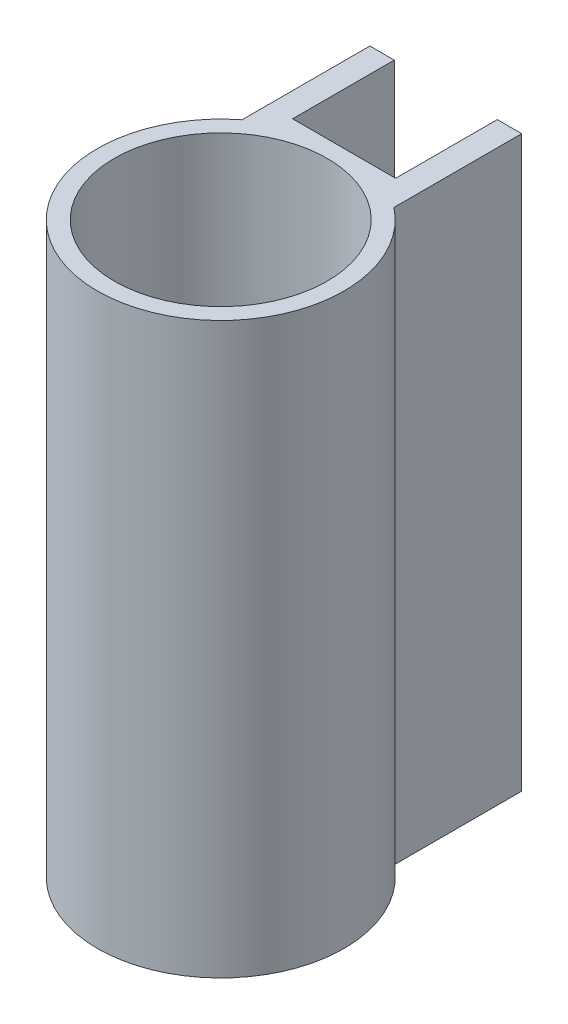
ISO-10303-21;
HEADER;
FILE_DESCRIPTION(('STEP AP214'),'2;1');
FILE_NAME('part.step','',(''),(''),'','','');
FILE_SCHEMA(('AUTOMOTIVE_DESIGN { 1 0 10303 214 1 1 1 1 }'));
ENDSEC;
DATA;
#1=APPLICATION_CONTEXT('core data for automotive mechanical design processes');
#2=APPLICATION_PROTOCOL_DEFINITION('international standard','automotive_design',2000,#1);
#3=PRODUCT_CONTEXT('',#1,'mechanical');
#4=PRODUCT('Part','Part','',(#3));
#5=PRODUCT_RELATED_PRODUCT_CATEGORY('part','',(#4));
#6=PRODUCT_DEFINITION_FORMATION('','',#4);
#7=PRODUCT_DEFINITION_CONTEXT('part definition',#1,'design');
#8=PRODUCT_DEFINITION('design','',#6,#7);
#9=PRODUCT_DEFINITION_SHAPE('','',#8);
#10=(LENGTH_UNIT() NAMED_UNIT(*) SI_UNIT(.MILLI.,.METRE.));
#11=(NAMED_UNIT(*) PLANE_ANGLE_UNIT() SI_UNIT($,.RADIAN.));
#12=(NAMED_UNIT(*) SI_UNIT($,.STERADIAN.) SOLID_ANGLE_UNIT());
#13=UNCERTAINTY_MEASURE_WITH_UNIT(LENGTH_MEASURE(1.E-05),#10,'distance_accuracy_value','');
#14=(GEOMETRIC_REPRESENTATION_CONTEXT(3) GLOBAL_UNCERTAINTY_ASSIGNED_CONTEXT((#13)) GLOBAL_UNIT_ASSIGNED_CONTEXT((#10,
#11,#12)) REPRESENTATION_CONTEXT('',''));
#15=CARTESIAN_POINT('',(0.,0.,0.));
#16=DIRECTION('',(0.,0.,1.));
#17=DIRECTION('',(1.,0.,0.));
#18=AXIS2_PLACEMENT_3D('',#15,#16,#17);
#19=CARTESIAN_POINT('',(0.,5.08,0.));
#20=DIRECTION('',(0.,1.,0.));
#21=DIRECTION('',(0.,0.,1.));
#22=AXIS2_PLACEMENT_3D('',#19,#20,#21);
#23=PLANE('',#22);
#24=CARTESIAN_POINT('',(0.,5.08,0.));
#25=DIRECTION('',(0.,1.,0.));
#26=DIRECTION('',(0.,0.,1.));
#27=AXIS2_PLACEMENT_3D('',#24,#25,#26);
#28=CIRCLE('',#27,9.652);
#29=CARTESIAN_POINT('',(0.,5.08,9.652));
#30=VERTEX_POINT('',#29);
#31=EDGE_CURVE('E47',#30,#30,#28,.T.);
#32=ORIENTED_EDGE('',*,*,#31,.F.);
#33=EDGE_LOOP('',(#32));
#34=FACE_BOUND('',#33,.T.);
#35=CARTESIAN_POINT('',(0.,5.08,0.));
#36=DIRECTION('',(0.,1.,0.));
#37=DIRECTION('',(0.,0.,1.));
#38=AXIS2_PLACEMENT_3D('',#35,#36,#37);
#39=CIRCLE('',#38,19.939);
#40=CARTESIAN_POINT('',(0.,5.08,19.939));
#41=VERTEX_POINT('',#40);
#42=EDGE_CURVE('E148',#41,#41,#39,.T.);
#43=ORIENTED_EDGE('',*,*,#42,.T.);
#44=EDGE_LOOP('',(#43));
#45=FACE_BOUND('',#44,.T.);
#46=ADVANCED_FACE('F39',(#34,#45),#23,.T.);
#47=CARTESIAN_POINT('',(0.,5.08,0.));
#48=DIRECTION('',(0.,-1.,0.));
#49=DIRECTION('',(0.,0.,-1.));
#50=AXIS2_PLACEMENT_3D('',#47,#48,#49);
#51=CYLINDRICAL_SURFACE('',#50,23.114);
#52=CARTESIAN_POINT('',(0.,0.,0.));
#53=DIRECTION('',(0.,1.,0.));
#54=DIRECTION('',(0.,0.,1.));
#55=AXIS2_PLACEMENT_3D('',#52,#53,#54);
#56=CIRCLE('',#55,23.114);
#57=CARTESIAN_POINT('',(-14.224,0.,-18.2190784618762));
#58=VERTEX_POINT('',#57);
#59=CARTESIAN_POINT('',(14.224,0.,-18.2190784618762));
#60=VERTEX_POINT('',#59);
#61=EDGE_CURVE('E11',#58,#60,#56,.T.);
#62=ORIENTED_EDGE('',*,*,#61,.T.);
#63=DIRECTION('',(0.,1.,0.));
#64=VECTOR('',#63,1.);
#65=CARTESIAN_POINT('',(14.224,-79.9890321731673,-18.2190784618762));
#66=LINE('',#65,#64);
#67=CARTESIAN_POINT('',(14.224,106.68,-18.2190784618762));
#68=VERTEX_POINT('',#67);
#69=EDGE_CURVE('E108',#60,#68,#66,.T.);
#70=ORIENTED_EDGE('',*,*,#69,.T.);
#71=CARTESIAN_POINT('',(0.,106.68,0.));
#72=DIRECTION('',(0.,1.,0.));
#73=DIRECTION('',(0.,0.,1.));
#74=AXIS2_PLACEMENT_3D('',#71,#72,#73);
#75=CIRCLE('',#74,23.114);
#76=CARTESIAN_POINT('',(-14.224,106.68,-18.2190784618762));
#77=VERTEX_POINT('',#76);
#78=EDGE_CURVE('E111',#77,#68,#75,.T.);
#79=ORIENTED_EDGE('',*,*,#78,.F.);
#80=DIRECTION('',(0.,1.,0.));
#81=VECTOR('',#80,1.);
#82=CARTESIAN_POINT('',(-14.224,-79.9890321731673,-18.2190784618762));
#83=LINE('',#82,#81);
#84=EDGE_CURVE('E85',#58,#77,#83,.T.);
#85=ORIENTED_EDGE('',*,*,#84,.F.);
#86=EDGE_LOOP('',(#62,#70,#79,#85));
#87=FACE_BOUND('',#86,.T.);
#88=ADVANCED_FACE('F41',(#87),#51,.T.);
#89=CARTESIAN_POINT('',(0.,0.,0.));
#90=DIRECTION('',(0.,1.,0.));
#91=DIRECTION('',(0.,0.,1.));
#92=AXIS2_PLACEMENT_3D('',#89,#90,#91);
#93=PLANE('',#92);
#94=DIRECTION('',(0.,0.,1.));
#95=VECTOR('',#94,1.);
#96=CARTESIAN_POINT('',(-9.652,0.,-42.164));
#97=LINE('',#96,#95);
#98=CARTESIAN_POINT('',(-9.652,0.,-42.164));
#99=VERTEX_POINT('',#98);
#100=CARTESIAN_POINT('',(-9.652,0.,-23.114));
#101=VERTEX_POINT('',#100);
#102=EDGE_CURVE('E154',#99,#101,#97,.T.);
#103=ORIENTED_EDGE('',*,*,#102,.T.);
#104=DIRECTION('',(1.,0.,0.));
#105=VECTOR('',#104,1.);
#106=CARTESIAN_POINT('',(-9.652,0.,-23.114));
#107=LINE('',#106,#105);
#108=CARTESIAN_POINT('',(9.652,0.,-23.114));
#109=VERTEX_POINT('',#108);
#110=EDGE_CURVE('E152',#101,#109,#107,.T.);
#111=ORIENTED_EDGE('',*,*,#110,.T.);
#112=DIRECTION('',(0.,0.,-1.));
#113=VECTOR('',#112,1.);
#114=CARTESIAN_POINT('',(9.652,0.,-23.114));
#115=LINE('',#114,#113);
#116=CARTESIAN_POINT('',(9.652,0.,-42.164));
#117=VERTEX_POINT('',#116);
#118=EDGE_CURVE('E75',#109,#117,#115,.T.);
#119=ORIENTED_EDGE('',*,*,#118,.T.);
#120=DIRECTION('',(1.,0.,0.));
#121=VECTOR('',#120,1.);
#122=CARTESIAN_POINT('',(9.652,0.,-42.164));
#123=LINE('',#122,#121);
#124=CARTESIAN_POINT('',(14.224,0.,-42.164));
#125=VERTEX_POINT('',#124);
#126=EDGE_CURVE('E78',#117,#125,#123,.T.);
#127=ORIENTED_EDGE('',*,*,#126,.T.);
#128=DIRECTION('',(0.,0.,1.));
#129=VECTOR('',#128,1.);
#130=CARTESIAN_POINT('',(14.224,0.,-42.164));
#131=LINE('',#130,#129);
#132=EDGE_CURVE('E146',#125,#60,#131,.T.);
#133=ORIENTED_EDGE('',*,*,#132,.T.);
#134=ORIENTED_EDGE('',*,*,#61,.F.);
#135=DIRECTION('',(0.,0.,-1.));
#136=VECTOR('',#135,1.);
#137=CARTESIAN_POINT('',(-14.224,0.,-18.2190784618762));
#138=LINE('',#137,#136);
#139=CARTESIAN_POINT('',(-14.224,0.,-42.164));
#140=VERTEX_POINT('',#139);
#141=EDGE_CURVE('E149',#58,#140,#138,.T.);
#142=ORIENTED_EDGE('',*,*,#141,.T.);
#143=DIRECTION('',(1.,0.,0.));
#144=VECTOR('',#143,1.);
#145=CARTESIAN_POINT('',(-14.224,0.,-42.164));
#146=LINE('',#145,#144);
#147=EDGE_CURVE('E157',#140,#99,#146,.T.);
#148=ORIENTED_EDGE('',*,*,#147,.T.);
#149=EDGE_LOOP('',(#103,#111,#119,#127,#133,#134,#142,#148));
#150=FACE_BOUND('',#149,.T.);
#151=CARTESIAN_POINT('',(0.,0.,0.));
#152=DIRECTION('',(0.,1.,0.));
#153=DIRECTION('',(0.,0.,1.));
#154=AXIS2_PLACEMENT_3D('',#151,#152,#153);
#155=CIRCLE('',#154,9.652);
#156=CARTESIAN_POINT('',(0.,0.,9.652));
#157=VERTEX_POINT('',#156);
#158=EDGE_CURVE('E174',#157,#157,#155,.T.);
#159=ORIENTED_EDGE('',*,*,#158,.T.);
#160=EDGE_LOOP('',(#159));
#161=FACE_BOUND('',#160,.T.);
#162=ADVANCED_FACE('F179',(#150,#161),#93,.F.);
#163=CARTESIAN_POINT('',(0.,5.08,0.));
#164=DIRECTION('',(0.,-1.,0.));
#165=DIRECTION('',(0.,0.,-1.));
#166=AXIS2_PLACEMENT_3D('',#163,#164,#165);
#167=CYLINDRICAL_SURFACE('',#166,9.652);
#168=ORIENTED_EDGE('',*,*,#31,.T.);
#169=EDGE_LOOP('',(#168));
#170=FACE_BOUND('',#169,.T.);
#171=ORIENTED_EDGE('',*,*,#158,.F.);
#172=EDGE_LOOP('',(#171));
#173=FACE_BOUND('',#172,.T.);
#174=ADVANCED_FACE('F181',(#170,#173),#167,.F.);
#175=CARTESIAN_POINT('',(14.224,-79.9890321731673,-42.164));
#176=DIRECTION('',(1.,0.,0.));
#177=DIRECTION('',(0.,0.,-1.));
#178=AXIS2_PLACEMENT_3D('',#175,#176,#177);
#179=PLANE('',#178);
#180=ORIENTED_EDGE('',*,*,#132,.F.);
#181=DIRECTION('',(0.,1.,0.));
#182=VECTOR('',#181,1.);
#183=CARTESIAN_POINT('',(14.224,-79.9890321731673,-42.164));
#184=LINE('',#183,#182);
#185=CARTESIAN_POINT('',(14.224,106.68,-42.164));
#186=VERTEX_POINT('',#185);
#187=EDGE_CURVE('E114',#125,#186,#184,.T.);
#188=ORIENTED_EDGE('',*,*,#187,.T.);
#189=DIRECTION('',(0.,0.,-1.));
#190=VECTOR('',#189,1.);
#191=CARTESIAN_POINT('',(14.224,106.68,-42.164));
#192=LINE('',#191,#190);
#193=EDGE_CURVE('E118',#68,#186,#192,.T.);
#194=ORIENTED_EDGE('',*,*,#193,.F.);
#195=ORIENTED_EDGE('',*,*,#69,.F.);
#196=EDGE_LOOP('',(#180,#188,#194,#195));
#197=FACE_BOUND('',#196,.T.);
#198=ADVANCED_FACE('F119',(#197),#179,.T.);
#199=CARTESIAN_POINT('',(9.652,-79.9890321731673,-42.164));
#200=DIRECTION('',(0.,0.,-1.));
#201=DIRECTION('',(-1.,0.,0.));
#202=AXIS2_PLACEMENT_3D('',#199,#200,#201);
#203=PLANE('',#202);
#204=ORIENTED_EDGE('',*,*,#126,.F.);
#205=DIRECTION('',(0.,1.,0.));
#206=VECTOR('',#205,1.);
#207=CARTESIAN_POINT('',(9.652,-79.9890321731673,-42.164));
#208=LINE('',#207,#206);
#209=CARTESIAN_POINT('',(9.652,106.68,-42.164));
#210=VERTEX_POINT('',#209);
#211=EDGE_CURVE('E169',#117,#210,#208,.T.);
#212=ORIENTED_EDGE('',*,*,#211,.T.);
#213=DIRECTION('',(-1.,0.,0.));
#214=VECTOR('',#213,1.);
#215=CARTESIAN_POINT('',(9.652,106.68,-42.164));
#216=LINE('',#215,#214);
#217=EDGE_CURVE('E123',#186,#210,#216,.T.);
#218=ORIENTED_EDGE('',*,*,#217,.F.);
#219=ORIENTED_EDGE('',*,*,#187,.F.);
#220=EDGE_LOOP('',(#204,#212,#218,#219));
#221=FACE_BOUND('',#220,.T.);
#222=ADVANCED_FACE('F189',(#221),#203,.T.);
#223=CARTESIAN_POINT('',(9.652,-79.9890321731673,-23.114));
#224=DIRECTION('',(-1.,0.,0.));
#225=DIRECTION('',(0.,0.,1.));
#226=AXIS2_PLACEMENT_3D('',#223,#224,#225);
#227=PLANE('',#226);
#228=ORIENTED_EDGE('',*,*,#118,.F.);
#229=DIRECTION('',(0.,1.,0.));
#230=VECTOR('',#229,1.);
#231=CARTESIAN_POINT('',(9.652,-79.9890321731673,-23.114));
#232=LINE('',#231,#230);
#233=CARTESIAN_POINT('',(9.652,106.68,-23.114));
#234=VERTEX_POINT('',#233);
#235=EDGE_CURVE('E167',#109,#234,#232,.T.);
#236=ORIENTED_EDGE('',*,*,#235,.T.);
#237=DIRECTION('',(0.,0.,1.));
#238=VECTOR('',#237,1.);
#239=CARTESIAN_POINT('',(9.652,106.68,-23.114));
#240=LINE('',#239,#238);
#241=EDGE_CURVE('E134',#210,#234,#240,.T.);
#242=ORIENTED_EDGE('',*,*,#241,.F.);
#243=ORIENTED_EDGE('',*,*,#211,.F.);
#244=EDGE_LOOP('',(#228,#236,#242,#243));
#245=FACE_BOUND('',#244,.T.);
#246=ADVANCED_FACE('F225',(#245),#227,.T.);
#247=CARTESIAN_POINT('',(-9.652,-79.9890321731673,-23.114));
#248=DIRECTION('',(0.,0.,-1.));
#249=DIRECTION('',(-1.,0.,0.));
#250=AXIS2_PLACEMENT_3D('',#247,#248,#249);
#251=PLANE('',#250);
#252=ORIENTED_EDGE('',*,*,#110,.F.);
#253=DIRECTION('',(0.,1.,0.));
#254=VECTOR('',#253,1.);
#255=CARTESIAN_POINT('',(-9.652,-79.9890321731673,-23.114));
#256=LINE('',#255,#254);
#257=CARTESIAN_POINT('',(-9.652,106.68,-23.114));
#258=VERTEX_POINT('',#257);
#259=EDGE_CURVE('E165',#101,#258,#256,.T.);
#260=ORIENTED_EDGE('',*,*,#259,.T.);
#261=DIRECTION('',(-1.,0.,0.));
#262=VECTOR('',#261,1.);
#263=CARTESIAN_POINT('',(-9.652,106.68,-23.114));
#264=LINE('',#263,#262);
#265=EDGE_CURVE('E137',#234,#258,#264,.T.);
#266=ORIENTED_EDGE('',*,*,#265,.F.);
#267=ORIENTED_EDGE('',*,*,#235,.F.);
#268=EDGE_LOOP('',(#252,#260,#266,#267));
#269=FACE_BOUND('',#268,.T.);
#270=ADVANCED_FACE('F221',(#269),#251,.T.);
#271=CARTESIAN_POINT('',(-9.652,-79.9890321731673,-42.164));
#272=DIRECTION('',(1.,0.,0.));
#273=DIRECTION('',(0.,0.,-1.));
#274=AXIS2_PLACEMENT_3D('',#271,#272,#273);
#275=PLANE('',#274);
#276=ORIENTED_EDGE('',*,*,#102,.F.);
#277=DIRECTION('',(0.,1.,0.));
#278=VECTOR('',#277,1.);
#279=CARTESIAN_POINT('',(-9.652,-79.9890321731673,-42.164));
#280=LINE('',#279,#278);
#281=CARTESIAN_POINT('',(-9.652,106.68,-42.164));
#282=VERTEX_POINT('',#281);
#283=EDGE_CURVE('E163',#99,#282,#280,.T.);
#284=ORIENTED_EDGE('',*,*,#283,.T.);
#285=DIRECTION('',(0.,0.,-1.));
#286=VECTOR('',#285,1.);
#287=CARTESIAN_POINT('',(-9.652,106.68,-42.164));
#288=LINE('',#287,#286);
#289=EDGE_CURVE('E140',#258,#282,#288,.T.);
#290=ORIENTED_EDGE('',*,*,#289,.F.);
#291=ORIENTED_EDGE('',*,*,#259,.F.);
#292=EDGE_LOOP('',(#276,#284,#290,#291));
#293=FACE_BOUND('',#292,.T.);
#294=ADVANCED_FACE('F217',(#293),#275,.T.);
#295=CARTESIAN_POINT('',(-14.224,-79.9890321731673,-42.164));
#296=DIRECTION('',(0.,0.,-1.));
#297=DIRECTION('',(-1.,0.,0.));
#298=AXIS2_PLACEMENT_3D('',#295,#296,#297);
#299=PLANE('',#298);
#300=ORIENTED_EDGE('',*,*,#147,.F.);
#301=DIRECTION('',(0.,1.,0.));
#302=VECTOR('',#301,1.);
#303=CARTESIAN_POINT('',(-14.224,-79.9890321731673,-42.164));
#304=LINE('',#303,#302);
#305=CARTESIAN_POINT('',(-14.224,106.68,-42.164));
#306=VERTEX_POINT('',#305);
#307=EDGE_CURVE('E161',#140,#306,#304,.T.);
#308=ORIENTED_EDGE('',*,*,#307,.T.);
#309=DIRECTION('',(-1.,0.,0.));
#310=VECTOR('',#309,1.);
#311=CARTESIAN_POINT('',(-14.224,106.68,-42.164));
#312=LINE('',#311,#310);
#313=EDGE_CURVE('E143',#282,#306,#312,.T.);
#314=ORIENTED_EDGE('',*,*,#313,.F.);
#315=ORIENTED_EDGE('',*,*,#283,.F.);
#316=EDGE_LOOP('',(#300,#308,#314,#315));
#317=FACE_BOUND('',#316,.T.);
#318=ADVANCED_FACE('F214',(#317),#299,.T.);
#319=CARTESIAN_POINT('',(-14.224,-79.9890321731673,-18.2190784618762));
#320=DIRECTION('',(-1.,0.,0.));
#321=DIRECTION('',(0.,0.,1.));
#322=AXIS2_PLACEMENT_3D('',#319,#320,#321);
#323=PLANE('',#322);
#324=ORIENTED_EDGE('',*,*,#141,.F.);
#325=ORIENTED_EDGE('',*,*,#84,.T.);
#326=DIRECTION('',(0.,0.,1.));
#327=VECTOR('',#326,1.);
#328=CARTESIAN_POINT('',(-14.224,106.68,-18.2190784618762));
#329=LINE('',#328,#327);
#330=EDGE_CURVE('E115',#306,#77,#329,.T.);
#331=ORIENTED_EDGE('',*,*,#330,.F.);
#332=ORIENTED_EDGE('',*,*,#307,.F.);
#333=EDGE_LOOP('',(#324,#325,#331,#332));
#334=FACE_BOUND('',#333,.T.);
#335=ADVANCED_FACE('F204',(#334),#323,.T.);
#336=CARTESIAN_POINT('',(0.,-79.9890321731673,0.));
#337=DIRECTION('',(0.,1.,0.));
#338=DIRECTION('',(0.,0.,1.));
#339=AXIS2_PLACEMENT_3D('',#336,#337,#338);
#340=CYLINDRICAL_SURFACE('',#339,19.939);
#341=ORIENTED_EDGE('',*,*,#42,.F.);
#342=EDGE_LOOP('',(#341));
#343=FACE_BOUND('',#342,.T.);
#344=CARTESIAN_POINT('',(0.,106.68,0.));
#345=DIRECTION('',(0.,1.,0.));
#346=DIRECTION('',(0.,0.,1.));
#347=AXIS2_PLACEMENT_3D('',#344,#345,#346);
#348=CIRCLE('',#347,19.939);
#349=CARTESIAN_POINT('',(0.,106.68,19.939));
#350=VERTEX_POINT('',#349);
#351=EDGE_CURVE('E128',#350,#350,#348,.T.);
#352=ORIENTED_EDGE('',*,*,#351,.T.);
#353=EDGE_LOOP('',(#352));
#354=FACE_BOUND('',#353,.T.);
#355=ADVANCED_FACE('F201',(#343,#354),#340,.F.);
#356=CARTESIAN_POINT('',(0.,106.68,0.));
#357=DIRECTION('',(0.,1.,0.));
#358=DIRECTION('',(0.,0.,1.));
#359=AXIS2_PLACEMENT_3D('',#356,#357,#358);
#360=PLANE('',#359);
#361=ORIENTED_EDGE('',*,*,#78,.T.);
#362=ORIENTED_EDGE('',*,*,#193,.T.);
#363=ORIENTED_EDGE('',*,*,#217,.T.);
#364=ORIENTED_EDGE('',*,*,#241,.T.);
#365=ORIENTED_EDGE('',*,*,#265,.T.);
#366=ORIENTED_EDGE('',*,*,#289,.T.);
#367=ORIENTED_EDGE('',*,*,#313,.T.);
#368=ORIENTED_EDGE('',*,*,#330,.T.);
#369=EDGE_LOOP('',(#361,#362,#363,#364,#365,#366,#367,#368));
#370=FACE_BOUND('',#369,.T.);
#371=ORIENTED_EDGE('',*,*,#351,.F.);
#372=EDGE_LOOP('',(#371));
#373=FACE_BOUND('',#372,.T.);
#374=ADVANCED_FACE('F125',(#370,#373),#360,.T.);
#375=CLOSED_SHELL('',(#46,#88,#162,#174,#198,#222,#246,#270,#294,#318,#335,#355,#374));
#376=MANIFOLD_SOLID_BREP('B2',#375);
#377=ADVANCED_BREP_SHAPE_REPRESENTATION('',(#18,#376),#14);
#378=SHAPE_DEFINITION_REPRESENTATION(#9,#377);
ENDSEC;
END-ISO-10303-21;
